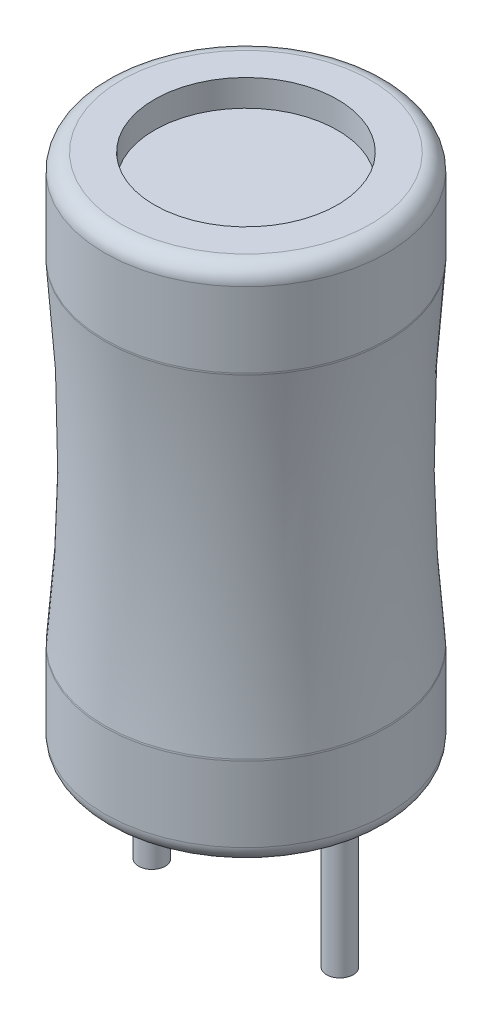
ISO-10303-21;
HEADER;
FILE_DESCRIPTION(('STEP AP214'),'2;1');
FILE_NAME('part.step','',(''),(''),'','','');
FILE_SCHEMA(('AUTOMOTIVE_DESIGN { 1 0 10303 214 1 1 1 1 }'));
ENDSEC;
DATA;
#1=APPLICATION_CONTEXT('core data for automotive mechanical design processes');
#2=APPLICATION_PROTOCOL_DEFINITION('international standard','automotive_design',2000,#1);
#3=PRODUCT_CONTEXT('',#1,'mechanical');
#4=PRODUCT('Part','Part','',(#3));
#5=PRODUCT_RELATED_PRODUCT_CATEGORY('part','',(#4));
#6=PRODUCT_DEFINITION_FORMATION('','',#4);
#7=PRODUCT_DEFINITION_CONTEXT('part definition',#1,'design');
#8=PRODUCT_DEFINITION('design','',#6,#7);
#9=PRODUCT_DEFINITION_SHAPE('','',#8);
#10=(LENGTH_UNIT() NAMED_UNIT(*) SI_UNIT(.MILLI.,.METRE.));
#11=(NAMED_UNIT(*) PLANE_ANGLE_UNIT() SI_UNIT($,.RADIAN.));
#12=(NAMED_UNIT(*) SI_UNIT($,.STERADIAN.) SOLID_ANGLE_UNIT());
#13=UNCERTAINTY_MEASURE_WITH_UNIT(LENGTH_MEASURE(1.E-05),#10,'distance_accuracy_value','');
#14=(GEOMETRIC_REPRESENTATION_CONTEXT(3) GLOBAL_UNCERTAINTY_ASSIGNED_CONTEXT((#13)) GLOBAL_UNIT_ASSIGNED_CONTEXT((#10,
#11,#12)) REPRESENTATION_CONTEXT('',''));
#15=CARTESIAN_POINT('',(0.,0.,0.));
#16=DIRECTION('',(0.,0.,1.));
#17=DIRECTION('',(1.,0.,0.));
#18=AXIS2_PLACEMENT_3D('',#15,#16,#17);
#19=CARTESIAN_POINT('',(0.,12.5652577925041,0.));
#20=DIRECTION('',(0.,1.,0.));
#21=DIRECTION('',(0.,0.,1.));
#22=AXIS2_PLACEMENT_3D('',#19,#20,#21);
#23=CYLINDRICAL_SURFACE('',#22,2.75);
#24=CARTESIAN_POINT('',(0.,-7.8,0.));
#25=DIRECTION('',(0.,1.,0.));
#26=DIRECTION('',(0.,0.,1.));
#27=AXIS2_PLACEMENT_3D('',#24,#25,#26);
#28=CIRCLE('',#27,2.75);
#29=CARTESIAN_POINT('',(2.72267699115044,-7.8,-0.386691093587599));
#30=VERTEX_POINT('',#29);
#31=CARTESIAN_POINT('',(-2.72267699115044,-7.8,-0.386691093587601));
#32=VERTEX_POINT('',#31);
#33=EDGE_CURVE('E86',#30,#32,#28,.T.);
#34=ORIENTED_EDGE('',*,*,#33,.F.);
#35=DIRECTION('',(0.,1.,0.));
#36=VECTOR('',#35,1.);
#37=CARTESIAN_POINT('',(2.72267699115044,-9.5,-0.386691093587599));
#38=LINE('',#37,#36);
#39=CARTESIAN_POINT('',(2.72267699115044,-7.,-0.386691093587599));
#40=VERTEX_POINT('',#39);
#41=EDGE_CURVE('E78',#30,#40,#38,.T.);
#42=ORIENTED_EDGE('',*,*,#41,.T.);
#43=CARTESIAN_POINT('',(0.,-7.,0.));
#44=DIRECTION('',(0.,1.,0.));
#45=DIRECTION('',(0.,0.,1.));
#46=AXIS2_PLACEMENT_3D('',#43,#44,#45);
#47=CIRCLE('',#46,2.75);
#48=CARTESIAN_POINT('',(-2.72267699115044,-7.,-0.386691093587599));
#49=VERTEX_POINT('',#48);
#50=EDGE_CURVE('E58',#40,#49,#47,.T.);
#51=ORIENTED_EDGE('',*,*,#50,.T.);
#52=DIRECTION('',(0.,1.,0.));
#53=VECTOR('',#52,1.);
#54=CARTESIAN_POINT('',(-2.72267699115044,-9.5,-0.386691093587599));
#55=LINE('',#54,#53);
#56=EDGE_CURVE('E314',#49,#32,#55,.F.);
#57=ORIENTED_EDGE('',*,*,#56,.T.);
#58=EDGE_LOOP('',(#34,#42,#51,#57));
#59=FACE_BOUND('',#58,.T.);
#60=ADVANCED_FACE('F35',(#59),#23,.F.);
#61=CARTESIAN_POINT('',(-2.72267699115044,-7.,0.386691093587599));
#62=VERTEX_POINT('',#61);
#63=CARTESIAN_POINT('',(2.72267699115044,-7.,0.386691093587599));
#64=VERTEX_POINT('',#63);
#65=EDGE_CURVE('E91',#62,#64,#47,.T.);
#66=ORIENTED_EDGE('',*,*,#65,.T.);
#67=DIRECTION('',(0.,1.,0.));
#68=VECTOR('',#67,1.);
#69=CARTESIAN_POINT('',(2.72267699115044,-9.5,0.386691093587599));
#70=LINE('',#69,#68);
#71=CARTESIAN_POINT('',(2.72267699115044,-7.8,0.386691093587599));
#72=VERTEX_POINT('',#71);
#73=EDGE_CURVE('E50',#64,#72,#70,.F.);
#74=ORIENTED_EDGE('',*,*,#73,.T.);
#75=CARTESIAN_POINT('',(-2.72267699115044,-7.8,0.386691093587599));
#76=VERTEX_POINT('',#75);
#77=EDGE_CURVE('E99',#76,#72,#28,.T.);
#78=ORIENTED_EDGE('',*,*,#77,.F.);
#79=DIRECTION('',(0.,1.,0.));
#80=VECTOR('',#79,1.);
#81=CARTESIAN_POINT('',(-2.72267699115044,-9.5,0.386691093587599));
#82=LINE('',#81,#80);
#83=EDGE_CURVE('E305',#76,#62,#82,.T.);
#84=ORIENTED_EDGE('',*,*,#83,.T.);
#85=EDGE_LOOP('',(#66,#74,#78,#84));
#86=FACE_BOUND('',#85,.T.);
#87=ADVANCED_FACE('F135',(#86),#23,.F.);
#88=CARTESIAN_POINT('',(0.,7.3,0.));
#89=DIRECTION('',(0.,1.,0.));
#90=DIRECTION('',(0.,0.,1.));
#91=AXIS2_PLACEMENT_3D('',#88,#89,#90);
#92=TOROIDAL_SURFACE('',#91,3.75,0.5);
#93=CARTESIAN_POINT('',(0.,7.3,0.));
#94=DIRECTION('',(0.,1.,0.));
#95=DIRECTION('',(0.,0.,1.));
#96=AXIS2_PLACEMENT_3D('',#93,#94,#95);
#97=CIRCLE('',#96,4.25);
#98=CARTESIAN_POINT('',(0.,7.3,4.25));
#99=VERTEX_POINT('',#98);
#100=EDGE_CURVE('E11',#99,#99,#97,.T.);
#101=ORIENTED_EDGE('',*,*,#100,.T.);
#102=EDGE_LOOP('',(#101));
#103=FACE_BOUND('',#102,.T.);
#104=CARTESIAN_POINT('',(0.,7.8,0.));
#105=DIRECTION('',(0.,1.,0.));
#106=DIRECTION('',(0.,0.,1.));
#107=AXIS2_PLACEMENT_3D('',#104,#105,#106);
#108=CIRCLE('',#107,3.75);
#109=CARTESIAN_POINT('',(0.,7.8,3.75));
#110=VERTEX_POINT('',#109);
#111=EDGE_CURVE('E304',#110,#110,#108,.T.);
#112=ORIENTED_EDGE('',*,*,#111,.F.);
#113=EDGE_LOOP('',(#112));
#114=FACE_BOUND('',#113,.T.);
#115=ADVANCED_FACE('F37',(#103,#114),#92,.T.);
#116=CARTESIAN_POINT('',(0.,12.5652577925041,0.));
#117=DIRECTION('',(0.,1.,0.));
#118=DIRECTION('',(0.,0.,1.));
#119=AXIS2_PLACEMENT_3D('',#116,#117,#118);
#120=CYLINDRICAL_SURFACE('',#119,4.25);
#121=CARTESIAN_POINT('',(0.,5.04938986141347,0.));
#122=DIRECTION('',(0.,1.,0.));
#123=DIRECTION('',(0.,0.,1.));
#124=AXIS2_PLACEMENT_3D('',#121,#122,#123);
#125=CIRCLE('',#124,4.25);
#126=CARTESIAN_POINT('',(0.,5.04938986141347,4.25));
#127=VERTEX_POINT('',#126);
#128=EDGE_CURVE('E43',#127,#127,#125,.T.);
#129=ORIENTED_EDGE('',*,*,#128,.T.);
#130=EDGE_LOOP('',(#129));
#131=FACE_BOUND('',#130,.T.);
#132=ORIENTED_EDGE('',*,*,#100,.F.);
#133=EDGE_LOOP('',(#132));
#134=FACE_BOUND('',#133,.T.);
#135=ADVANCED_FACE('F119',(#131,#134),#120,.T.);
#136=CARTESIAN_POINT('',(0.,5.04938986141347,0.));
#137=DIRECTION('',(0.,1.,0.));
#138=DIRECTION('',(0.,0.,1.));
#139=AXIS2_PLACEMENT_3D('',#136,#137,#138);
#140=TOROIDAL_SURFACE('',#139,3.75,0.5);
#141=CARTESIAN_POINT('',(0.,5.,0.));
#142=DIRECTION('',(0.,1.,0.));
#143=DIRECTION('',(0.,0.,1.));
#144=AXIS2_PLACEMENT_3D('',#141,#142,#143);
#145=CIRCLE('',#144,4.24755466191119);
#146=CARTESIAN_POINT('',(0.,5.,4.24755466191119));
#147=VERTEX_POINT('',#146);
#148=EDGE_CURVE('E114',#147,#147,#145,.T.);
#149=ORIENTED_EDGE('',*,*,#148,.T.);
#150=EDGE_LOOP('',(#149));
#151=FACE_BOUND('',#150,.T.);
#152=ORIENTED_EDGE('',*,*,#128,.F.);
#153=EDGE_LOOP('',(#152));
#154=FACE_BOUND('',#153,.T.);
#155=ADVANCED_FACE('F122',(#151,#154),#140,.T.);
#156=CARTESIAN_POINT('',(0.,0.,0.));
#157=DIRECTION('',(0.,1.,0.));
#158=DIRECTION('',(0.,0.,1.));
#159=AXIS2_PLACEMENT_3D('',#156,#157,#158);
#160=TOROIDAL_SURFACE('',#159,54.6176759450892,50.6176759450892);
#161=CARTESIAN_POINT('',(0.,-5.,0.));
#162=DIRECTION('',(0.,1.,0.));
#163=DIRECTION('',(0.,0.,1.));
#164=AXIS2_PLACEMENT_3D('',#161,#162,#163);
#165=CIRCLE('',#164,4.24755466191119);
#166=CARTESIAN_POINT('',(0.,-5.,4.24755466191119));
#167=VERTEX_POINT('',#166);
#168=EDGE_CURVE('E111',#167,#167,#165,.T.);
#169=ORIENTED_EDGE('',*,*,#168,.T.);
#170=EDGE_LOOP('',(#169));
#171=FACE_BOUND('',#170,.T.);
#172=ORIENTED_EDGE('',*,*,#148,.F.);
#173=EDGE_LOOP('',(#172));
#174=FACE_BOUND('',#173,.T.);
#175=ADVANCED_FACE('F124',(#171,#174),#160,.F.);
#176=CARTESIAN_POINT('',(0.,-5.04938986141347,0.));
#177=DIRECTION('',(0.,1.,0.));
#178=DIRECTION('',(0.,0.,1.));
#179=AXIS2_PLACEMENT_3D('',#176,#177,#178);
#180=TOROIDAL_SURFACE('',#179,3.75,0.5);
#181=CARTESIAN_POINT('',(0.,-5.04938986141347,0.));
#182=DIRECTION('',(0.,1.,0.));
#183=DIRECTION('',(0.,0.,1.));
#184=AXIS2_PLACEMENT_3D('',#181,#182,#183);
#185=CIRCLE('',#184,4.25);
#186=CARTESIAN_POINT('',(0.,-5.04938986141347,4.25));
#187=VERTEX_POINT('',#186);
#188=EDGE_CURVE('E108',#187,#187,#185,.T.);
#189=ORIENTED_EDGE('',*,*,#188,.T.);
#190=EDGE_LOOP('',(#189));
#191=FACE_BOUND('',#190,.T.);
#192=ORIENTED_EDGE('',*,*,#168,.F.);
#193=EDGE_LOOP('',(#192));
#194=FACE_BOUND('',#193,.T.);
#195=ADVANCED_FACE('F131',(#191,#194),#180,.T.);
#196=CARTESIAN_POINT('',(0.,12.5652577925041,0.));
#197=DIRECTION('',(0.,1.,0.));
#198=DIRECTION('',(0.,0.,1.));
#199=AXIS2_PLACEMENT_3D('',#196,#197,#198);
#200=CYLINDRICAL_SURFACE('',#199,4.25);
#201=CARTESIAN_POINT('',(0.,-7.3,0.));
#202=DIRECTION('',(0.,1.,0.));
#203=DIRECTION('',(0.,0.,1.));
#204=AXIS2_PLACEMENT_3D('',#201,#202,#203);
#205=CIRCLE('',#204,4.25);
#206=CARTESIAN_POINT('',(0.,-7.3,4.25));
#207=VERTEX_POINT('',#206);
#208=EDGE_CURVE('E105',#207,#207,#205,.T.);
#209=ORIENTED_EDGE('',*,*,#208,.T.);
#210=EDGE_LOOP('',(#209));
#211=FACE_BOUND('',#210,.T.);
#212=ORIENTED_EDGE('',*,*,#188,.F.);
#213=EDGE_LOOP('',(#212));
#214=FACE_BOUND('',#213,.T.);
#215=ADVANCED_FACE('F151',(#211,#214),#200,.T.);
#216=CARTESIAN_POINT('',(0.,-7.3,0.));
#217=DIRECTION('',(0.,1.,0.));
#218=DIRECTION('',(0.,0.,1.));
#219=AXIS2_PLACEMENT_3D('',#216,#217,#218);
#220=TOROIDAL_SURFACE('',#219,3.75,0.5);
#221=CARTESIAN_POINT('',(0.,-7.8,0.));
#222=DIRECTION('',(0.,1.,0.));
#223=DIRECTION('',(0.,0.,1.));
#224=AXIS2_PLACEMENT_3D('',#221,#222,#223);
#225=CIRCLE('',#224,3.75);
#226=CARTESIAN_POINT('',(0.,-7.8,3.75));
#227=VERTEX_POINT('',#226);
#228=EDGE_CURVE('E102',#227,#227,#225,.T.);
#229=ORIENTED_EDGE('',*,*,#228,.T.);
#230=EDGE_LOOP('',(#229));
#231=FACE_BOUND('',#230,.T.);
#232=ORIENTED_EDGE('',*,*,#208,.F.);
#233=EDGE_LOOP('',(#232));
#234=FACE_BOUND('',#233,.T.);
#235=ADVANCED_FACE('F147',(#231,#234),#220,.T.);
#236=CARTESIAN_POINT('',(0.,-7.8,3.75));
#237=DIRECTION('',(0.,-1.,0.));
#238=DIRECTION('',(0.,0.,-1.));
#239=AXIS2_PLACEMENT_3D('',#236,#237,#238);
#240=PLANE('',#239);
#241=ORIENTED_EDGE('',*,*,#77,.T.);
#242=CARTESIAN_POINT('',(2.825,-7.8,0.));
#243=DIRECTION('',(0.,-1.,0.));
#244=DIRECTION('',(0.,0.,-1.));
#245=AXIS2_PLACEMENT_3D('',#242,#243,#244);
#246=CIRCLE('',#245,0.4);
#247=EDGE_CURVE('E321',#72,#30,#246,.F.);
#248=ORIENTED_EDGE('',*,*,#247,.T.);
#249=ORIENTED_EDGE('',*,*,#33,.T.);
#250=CARTESIAN_POINT('',(-2.825,-7.8,0.));
#251=DIRECTION('',(0.,-1.,0.));
#252=DIRECTION('',(0.,0.,-1.));
#253=AXIS2_PLACEMENT_3D('',#250,#251,#252);
#254=CIRCLE('',#253,0.4);
#255=EDGE_CURVE('E309',#32,#76,#254,.F.);
#256=ORIENTED_EDGE('',*,*,#255,.T.);
#257=EDGE_LOOP('',(#241,#248,#249,#256));
#258=FACE_BOUND('',#257,.T.);
#259=ORIENTED_EDGE('',*,*,#228,.F.);
#260=EDGE_LOOP('',(#259));
#261=FACE_BOUND('',#260,.T.);
#262=ADVANCED_FACE('F144',(#258,#261),#240,.T.);
#263=CARTESIAN_POINT('',(0.,-7.,2.75));
#264=DIRECTION('',(0.,-1.,0.));
#265=DIRECTION('',(0.,0.,-1.));
#266=AXIS2_PLACEMENT_3D('',#263,#264,#265);
#267=PLANE('',#266);
#268=ORIENTED_EDGE('',*,*,#50,.F.);
#269=CARTESIAN_POINT('',(2.825,-7.,0.));
#270=DIRECTION('',(0.,-1.,0.));
#271=DIRECTION('',(0.,0.,1.));
#272=AXIS2_PLACEMENT_3D('',#269,#270,#271);
#273=CIRCLE('',#272,0.4);
#274=EDGE_CURVE('E75',#64,#40,#273,.T.);
#275=ORIENTED_EDGE('',*,*,#274,.F.);
#276=ORIENTED_EDGE('',*,*,#65,.F.);
#277=CARTESIAN_POINT('',(-2.825,-7.,0.));
#278=DIRECTION('',(0.,-1.,0.));
#279=DIRECTION('',(0.,0.,-1.));
#280=AXIS2_PLACEMENT_3D('',#277,#278,#279);
#281=CIRCLE('',#280,0.4);
#282=EDGE_CURVE('E87',#49,#62,#281,.T.);
#283=ORIENTED_EDGE('',*,*,#282,.F.);
#284=EDGE_LOOP('',(#268,#275,#276,#283));
#285=FACE_BOUND('',#284,.T.);
#286=ADVANCED_FACE('F90',(#285),#267,.T.);
#287=CARTESIAN_POINT('',(0.,7.,2.75));
#288=DIRECTION('',(0.,1.,0.));
#289=DIRECTION('',(0.,0.,1.));
#290=AXIS2_PLACEMENT_3D('',#287,#288,#289);
#291=PLANE('',#290);
#292=CARTESIAN_POINT('',(0.,7.,0.));
#293=DIRECTION('',(0.,1.,0.));
#294=DIRECTION('',(0.,0.,1.));
#295=AXIS2_PLACEMENT_3D('',#292,#293,#294);
#296=CIRCLE('',#295,2.75);
#297=CARTESIAN_POINT('',(0.,7.,2.75));
#298=VERTEX_POINT('',#297);
#299=EDGE_CURVE('E92',#298,#298,#296,.T.);
#300=ORIENTED_EDGE('',*,*,#299,.T.);
#301=EDGE_LOOP('',(#300));
#302=FACE_BOUND('',#301,.T.);
#303=ADVANCED_FACE('F189',(#302),#291,.T.);
#304=CARTESIAN_POINT('',(0.,12.5652577925041,0.));
#305=DIRECTION('',(0.,1.,0.));
#306=DIRECTION('',(0.,0.,1.));
#307=AXIS2_PLACEMENT_3D('',#304,#305,#306);
#308=CYLINDRICAL_SURFACE('',#307,2.75);
#309=CARTESIAN_POINT('',(0.,7.8,0.));
#310=DIRECTION('',(0.,1.,0.));
#311=DIRECTION('',(0.,0.,1.));
#312=AXIS2_PLACEMENT_3D('',#309,#310,#311);
#313=CIRCLE('',#312,2.75);
#314=CARTESIAN_POINT('',(0.,7.8,2.75));
#315=VERTEX_POINT('',#314);
#316=EDGE_CURVE('E95',#315,#315,#313,.T.);
#317=ORIENTED_EDGE('',*,*,#316,.T.);
#318=EDGE_LOOP('',(#317));
#319=FACE_BOUND('',#318,.T.);
#320=ORIENTED_EDGE('',*,*,#299,.F.);
#321=EDGE_LOOP('',(#320));
#322=FACE_BOUND('',#321,.T.);
#323=ADVANCED_FACE('F194',(#319,#322),#308,.F.);
#324=CARTESIAN_POINT('',(0.,7.8,3.75));
#325=DIRECTION('',(0.,1.,0.));
#326=DIRECTION('',(0.,0.,1.));
#327=AXIS2_PLACEMENT_3D('',#324,#325,#326);
#328=PLANE('',#327);
#329=ORIENTED_EDGE('',*,*,#111,.T.);
#330=EDGE_LOOP('',(#329));
#331=FACE_BOUND('',#330,.T.);
#332=ORIENTED_EDGE('',*,*,#316,.F.);
#333=EDGE_LOOP('',(#332));
#334=FACE_BOUND('',#333,.T.);
#335=ADVANCED_FACE('F200',(#331,#334),#328,.T.);
#336=CARTESIAN_POINT('',(-2.825,-12.,0.));
#337=DIRECTION('',(0.,1.,0.));
#338=DIRECTION('',(0.,0.,1.));
#339=AXIS2_PLACEMENT_3D('',#336,#337,#338);
#340=CYLINDRICAL_SURFACE('',#339,0.4);
#341=ORIENTED_EDGE('',*,*,#83,.F.);
#342=ORIENTED_EDGE('',*,*,#255,.F.);
#343=ORIENTED_EDGE('',*,*,#56,.F.);
#344=ORIENTED_EDGE('',*,*,#282,.T.);
#345=EDGE_LOOP('',(#341,#342,#343,#344));
#346=FACE_BOUND('',#345,.T.);
#347=CARTESIAN_POINT('',(-2.825,-12.,0.));
#348=DIRECTION('',(0.,-1.,0.));
#349=DIRECTION('',(0.,0.,-1.));
#350=AXIS2_PLACEMENT_3D('',#347,#348,#349);
#351=CIRCLE('',#350,0.4);
#352=CARTESIAN_POINT('',(-2.825,-12.,-0.4));
#353=VERTEX_POINT('',#352);
#354=EDGE_CURVE('E316',#353,#353,#351,.T.);
#355=ORIENTED_EDGE('',*,*,#354,.F.);
#356=EDGE_LOOP('',(#355));
#357=FACE_BOUND('',#356,.T.);
#358=ADVANCED_FACE('F208',(#346,#357),#340,.T.);
#359=CARTESIAN_POINT('',(-2.825,-12.,0.));
#360=DIRECTION('',(0.,-1.,0.));
#361=DIRECTION('',(0.,0.,-1.));
#362=AXIS2_PLACEMENT_3D('',#359,#360,#361);
#363=PLANE('',#362);
#364=ORIENTED_EDGE('',*,*,#354,.T.);
#365=EDGE_LOOP('',(#364));
#366=FACE_BOUND('',#365,.T.);
#367=ADVANCED_FACE('F216',(#366),#363,.T.);
#368=CARTESIAN_POINT('',(2.825,-12.,0.));
#369=DIRECTION('',(0.,1.,0.));
#370=DIRECTION('',(0.,0.,1.));
#371=AXIS2_PLACEMENT_3D('',#368,#369,#370);
#372=CYLINDRICAL_SURFACE('',#371,0.4);
#373=ORIENTED_EDGE('',*,*,#41,.F.);
#374=ORIENTED_EDGE('',*,*,#247,.F.);
#375=ORIENTED_EDGE('',*,*,#73,.F.);
#376=ORIENTED_EDGE('',*,*,#274,.T.);
#377=EDGE_LOOP('',(#373,#374,#375,#376));
#378=FACE_BOUND('',#377,.T.);
#379=CARTESIAN_POINT('',(2.825,-12.,0.));
#380=DIRECTION('',(0.,-1.,0.));
#381=DIRECTION('',(0.,0.,1.));
#382=AXIS2_PLACEMENT_3D('',#379,#380,#381);
#383=CIRCLE('',#382,0.4);
#384=CARTESIAN_POINT('',(2.825,-12.,0.4));
#385=VERTEX_POINT('',#384);
#386=EDGE_CURVE('E83',#385,#385,#383,.T.);
#387=ORIENTED_EDGE('',*,*,#386,.F.);
#388=EDGE_LOOP('',(#387));
#389=FACE_BOUND('',#388,.T.);
#390=ADVANCED_FACE('F76',(#378,#389),#372,.T.);
#391=CARTESIAN_POINT('',(2.825,-12.,0.));
#392=DIRECTION('',(0.,1.,0.));
#393=DIRECTION('',(0.,0.,1.));
#394=AXIS2_PLACEMENT_3D('',#391,#392,#393);
#395=PLANE('',#394);
#396=ORIENTED_EDGE('',*,*,#386,.T.);
#397=EDGE_LOOP('',(#396));
#398=FACE_BOUND('',#397,.T.);
#399=ADVANCED_FACE('F231',(#398),#395,.F.);
#400=CLOSED_SHELL('',(#60,#87,#115,#135,#155,#175,#195,#215,#235,#262,#286,#303,#323,#335,#358,
#367,#390,#399));
#401=MANIFOLD_SOLID_BREP('B2',#400);
#402=ADVANCED_BREP_SHAPE_REPRESENTATION('',(#18,#401),#14);
#403=SHAPE_DEFINITION_REPRESENTATION(#9,#402);
ENDSEC;
END-ISO-10303-21;
